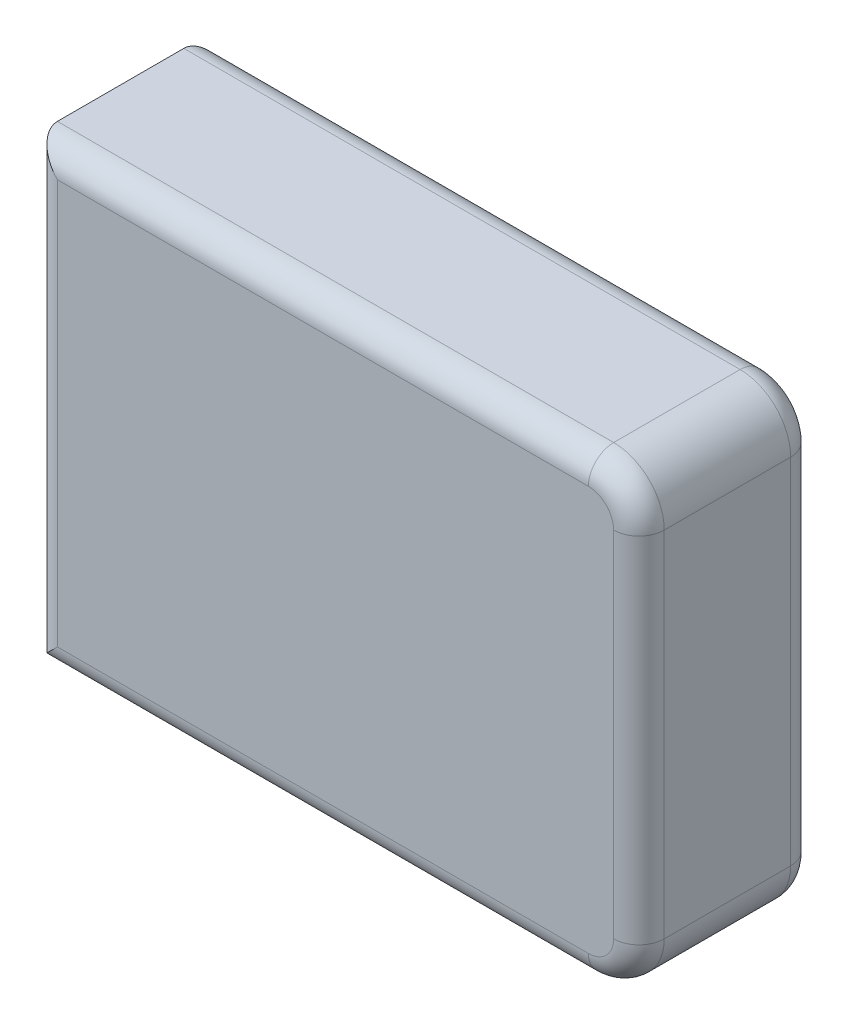
ISO-10303-21;
HEADER;
FILE_DESCRIPTION(('STEP AP214'),'2;1');
FILE_NAME('part.step','',(''),(''),'','','');
FILE_SCHEMA(('AUTOMOTIVE_DESIGN { 1 0 10303 214 1 1 1 1 }'));
ENDSEC;
DATA;
#1=APPLICATION_CONTEXT('core data for automotive mechanical design processes');
#2=APPLICATION_PROTOCOL_DEFINITION('international standard','automotive_design',2000,#1);
#3=PRODUCT_CONTEXT('',#1,'mechanical');
#4=PRODUCT('Part','Part','',(#3));
#5=PRODUCT_RELATED_PRODUCT_CATEGORY('part','',(#4));
#6=PRODUCT_DEFINITION_FORMATION('','',#4);
#7=PRODUCT_DEFINITION_CONTEXT('part definition',#1,'design');
#8=PRODUCT_DEFINITION('design','',#6,#7);
#9=PRODUCT_DEFINITION_SHAPE('','',#8);
#10=(LENGTH_UNIT() NAMED_UNIT(*) SI_UNIT(.MILLI.,.METRE.));
#11=(NAMED_UNIT(*) PLANE_ANGLE_UNIT() SI_UNIT($,.RADIAN.));
#12=(NAMED_UNIT(*) SI_UNIT($,.STERADIAN.) SOLID_ANGLE_UNIT());
#13=UNCERTAINTY_MEASURE_WITH_UNIT(LENGTH_MEASURE(1.E-05),#10,'distance_accuracy_value','');
#14=(GEOMETRIC_REPRESENTATION_CONTEXT(3) GLOBAL_UNCERTAINTY_ASSIGNED_CONTEXT((#13)) GLOBAL_UNIT_ASSIGNED_CONTEXT((#10,
#11,#12)) REPRESENTATION_CONTEXT('',''));
#15=CARTESIAN_POINT('',(0.,0.,0.));
#16=DIRECTION('',(0.,0.,1.));
#17=DIRECTION('',(1.,0.,0.));
#18=AXIS2_PLACEMENT_3D('',#15,#16,#17);
#19=CARTESIAN_POINT('',(60.,45.,35.));
#20=DIRECTION('',(-1.,0.,0.));
#21=DIRECTION('',(0.,-1.,0.));
#22=AXIS2_PLACEMENT_3D('',#19,#20,#21);
#23=PLANE('',#22);
#24=DIRECTION('',(0.,0.,-1.));
#25=VECTOR('',#24,1.);
#26=CARTESIAN_POINT('',(60.,-35.,35.));
#27=LINE('',#26,#25);
#28=CARTESIAN_POINT('',(60.,-35.,30.));
#29=VERTEX_POINT('',#28);
#30=CARTESIAN_POINT('',(60.,-35.,5.));
#31=VERTEX_POINT('',#30);
#32=EDGE_CURVE('E243',#29,#31,#27,.T.);
#33=ORIENTED_EDGE('',*,*,#32,.T.);
#34=DIRECTION('',(0.,1.,0.));
#35=VECTOR('',#34,1.);
#36=CARTESIAN_POINT('',(60.,45.,5.));
#37=LINE('',#36,#35);
#38=CARTESIAN_POINT('',(60.,35.,5.));
#39=VERTEX_POINT('',#38);
#40=EDGE_CURVE('E196',#31,#39,#37,.T.);
#41=ORIENTED_EDGE('',*,*,#40,.T.);
#42=DIRECTION('',(0.,0.,-1.));
#43=VECTOR('',#42,1.);
#44=CARTESIAN_POINT('',(60.,35.,35.));
#45=LINE('',#44,#43);
#46=CARTESIAN_POINT('',(60.,35.,30.));
#47=VERTEX_POINT('',#46);
#48=EDGE_CURVE('E245',#39,#47,#45,.F.);
#49=ORIENTED_EDGE('',*,*,#48,.T.);
#50=DIRECTION('',(0.,1.,0.));
#51=VECTOR('',#50,1.);
#52=CARTESIAN_POINT('',(60.,-35.,30.));
#53=LINE('',#52,#51);
#54=EDGE_CURVE('E201',#47,#29,#53,.F.);
#55=ORIENTED_EDGE('',*,*,#54,.T.);
#56=EDGE_LOOP('',(#33,#41,#49,#55));
#57=FACE_BOUND('',#56,.T.);
#58=ADVANCED_FACE('F38',(#57),#23,.F.);
#59=CARTESIAN_POINT('',(-60.,45.,35.));
#60=DIRECTION('',(0.,-1.,0.));
#61=DIRECTION('',(0.,0.,-1.));
#62=AXIS2_PLACEMENT_3D('',#59,#60,#61);
#63=PLANE('',#62);
#64=DIRECTION('',(0.,0.,-1.));
#65=VECTOR('',#64,1.);
#66=CARTESIAN_POINT('',(50.,45.,35.));
#67=LINE('',#66,#65);
#68=CARTESIAN_POINT('',(50.,45.,30.));
#69=VERTEX_POINT('',#68);
#70=CARTESIAN_POINT('',(50.,45.,5.));
#71=VERTEX_POINT('',#70);
#72=EDGE_CURVE('E152',#69,#71,#67,.T.);
#73=ORIENTED_EDGE('',*,*,#72,.T.);
#74=DIRECTION('',(-1.,0.,0.));
#75=VECTOR('',#74,1.);
#76=CARTESIAN_POINT('',(-60.,45.,5.));
#77=LINE('',#76,#75);
#78=CARTESIAN_POINT('',(-60.,45.,5.));
#79=VERTEX_POINT('',#78);
#80=EDGE_CURVE('E55',#71,#79,#77,.T.);
#81=ORIENTED_EDGE('',*,*,#80,.T.);
#82=DIRECTION('',(0.,0.,-1.));
#83=VECTOR('',#82,1.);
#84=CARTESIAN_POINT('',(-60.,45.,35.));
#85=LINE('',#84,#83);
#86=CARTESIAN_POINT('',(-60.,45.,30.));
#87=VERTEX_POINT('',#86);
#88=EDGE_CURVE('E247',#87,#79,#85,.T.);
#89=ORIENTED_EDGE('',*,*,#88,.F.);
#90=DIRECTION('',(-1.,0.,0.));
#91=VECTOR('',#90,1.);
#92=CARTESIAN_POINT('',(50.,45.,30.));
#93=LINE('',#92,#91);
#94=EDGE_CURVE('E206',#87,#69,#93,.F.);
#95=ORIENTED_EDGE('',*,*,#94,.T.);
#96=EDGE_LOOP('',(#73,#81,#89,#95));
#97=FACE_BOUND('',#96,.T.);
#98=ADVANCED_FACE('F274',(#97),#63,.F.);
#99=CARTESIAN_POINT('',(-60.,45.,35.));
#100=DIRECTION('',(1.,0.,0.));
#101=DIRECTION('',(0.,1.,0.));
#102=AXIS2_PLACEMENT_3D('',#99,#100,#101);
#103=PLANE('',#102);
#104=ORIENTED_EDGE('',*,*,#88,.T.);
#105=DIRECTION('',(0.,-1.,0.));
#106=VECTOR('',#105,1.);
#107=CARTESIAN_POINT('',(-60.,45.,5.));
#108=LINE('',#107,#106);
#109=CARTESIAN_POINT('',(-60.,-45.,5.));
#110=VERTEX_POINT('',#109);
#111=EDGE_CURVE('E208',#79,#110,#108,.T.);
#112=ORIENTED_EDGE('',*,*,#111,.T.);
#113=DIRECTION('',(0.,0.,-1.));
#114=VECTOR('',#113,1.);
#115=CARTESIAN_POINT('',(-60.,-45.,35.));
#116=LINE('',#115,#114);
#117=CARTESIAN_POINT('',(-60.,-45.,30.));
#118=VERTEX_POINT('',#117);
#119=EDGE_CURVE('E158',#118,#110,#116,.T.);
#120=ORIENTED_EDGE('',*,*,#119,.F.);
#121=DIRECTION('',(0.,-1.,0.));
#122=VECTOR('',#121,1.);
#123=CARTESIAN_POINT('',(-60.,45.,30.));
#124=LINE('',#123,#122);
#125=EDGE_CURVE('E62',#118,#87,#124,.F.);
#126=ORIENTED_EDGE('',*,*,#125,.T.);
#127=EDGE_LOOP('',(#104,#112,#120,#126));
#128=FACE_BOUND('',#127,.T.);
#129=ADVANCED_FACE('F279',(#128),#103,.F.);
#130=CARTESIAN_POINT('',(-60.,-45.,35.));
#131=DIRECTION('',(0.,1.,0.));
#132=DIRECTION('',(0.,0.,1.));
#133=AXIS2_PLACEMENT_3D('',#130,#131,#132);
#134=PLANE('',#133);
#135=ORIENTED_EDGE('',*,*,#119,.T.);
#136=DIRECTION('',(1.,0.,0.));
#137=VECTOR('',#136,1.);
#138=CARTESIAN_POINT('',(-60.,-45.,5.));
#139=LINE('',#138,#137);
#140=CARTESIAN_POINT('',(50.,-45.,5.));
#141=VERTEX_POINT('',#140);
#142=EDGE_CURVE('E11',#110,#141,#139,.T.);
#143=ORIENTED_EDGE('',*,*,#142,.T.);
#144=DIRECTION('',(0.,0.,-1.));
#145=VECTOR('',#144,1.);
#146=CARTESIAN_POINT('',(50.,-45.,35.));
#147=LINE('',#146,#145);
#148=CARTESIAN_POINT('',(50.,-45.,30.));
#149=VERTEX_POINT('',#148);
#150=EDGE_CURVE('E240',#141,#149,#147,.F.);
#151=ORIENTED_EDGE('',*,*,#150,.T.);
#152=DIRECTION('',(1.,0.,0.));
#153=VECTOR('',#152,1.);
#154=CARTESIAN_POINT('',(-60.,-45.,30.));
#155=LINE('',#154,#153);
#156=EDGE_CURVE('E47',#149,#118,#155,.F.);
#157=ORIENTED_EDGE('',*,*,#156,.T.);
#158=EDGE_LOOP('',(#135,#143,#151,#157));
#159=FACE_BOUND('',#158,.T.);
#160=ADVANCED_FACE('F251',(#159),#134,.F.);
#161=CARTESIAN_POINT('',(0.,0.,35.));
#162=DIRECTION('',(0.,0.,1.));
#163=DIRECTION('',(1.,0.,0.));
#164=AXIS2_PLACEMENT_3D('',#161,#162,#163);
#165=PLANE('',#164);
#166=CARTESIAN_POINT('',(50.,35.,35.));
#167=DIRECTION('',(0.,0.,1.));
#168=DIRECTION('',(1.,0.,0.));
#169=AXIS2_PLACEMENT_3D('',#166,#167,#168);
#170=CIRCLE('',#169,5.);
#171=CARTESIAN_POINT('',(55.,35.,35.));
#172=VERTEX_POINT('',#171);
#173=CARTESIAN_POINT('',(50.,40.,35.));
#174=VERTEX_POINT('',#173);
#175=EDGE_CURVE('E220',#172,#174,#170,.T.);
#176=ORIENTED_EDGE('',*,*,#175,.T.);
#177=DIRECTION('',(-1.,0.,0.));
#178=VECTOR('',#177,1.);
#179=CARTESIAN_POINT('',(-60.,40.,35.));
#180=LINE('',#179,#178);
#181=CARTESIAN_POINT('',(-55.,40.,35.));
#182=VERTEX_POINT('',#181);
#183=EDGE_CURVE('E211',#174,#182,#180,.T.);
#184=ORIENTED_EDGE('',*,*,#183,.T.);
#185=DIRECTION('',(0.,-1.,0.));
#186=VECTOR('',#185,1.);
#187=CARTESIAN_POINT('',(-55.,-45.,35.));
#188=LINE('',#187,#186);
#189=CARTESIAN_POINT('',(-55.,-40.,35.));
#190=VERTEX_POINT('',#189);
#191=EDGE_CURVE('E213',#182,#190,#188,.T.);
#192=ORIENTED_EDGE('',*,*,#191,.T.);
#193=DIRECTION('',(1.,0.,0.));
#194=VECTOR('',#193,1.);
#195=CARTESIAN_POINT('',(50.,-40.,35.));
#196=LINE('',#195,#194);
#197=CARTESIAN_POINT('',(50.,-40.,35.));
#198=VERTEX_POINT('',#197);
#199=EDGE_CURVE('E215',#190,#198,#196,.T.);
#200=ORIENTED_EDGE('',*,*,#199,.T.);
#201=CARTESIAN_POINT('',(50.,-35.,35.));
#202=DIRECTION('',(0.,0.,1.));
#203=DIRECTION('',(1.,0.,0.));
#204=AXIS2_PLACEMENT_3D('',#201,#202,#203);
#205=CIRCLE('',#204,5.);
#206=CARTESIAN_POINT('',(55.,-35.,35.));
#207=VERTEX_POINT('',#206);
#208=EDGE_CURVE('E217',#198,#207,#205,.T.);
#209=ORIENTED_EDGE('',*,*,#208,.T.);
#210=DIRECTION('',(0.,1.,0.));
#211=VECTOR('',#210,1.);
#212=CARTESIAN_POINT('',(55.,35.,35.));
#213=LINE('',#212,#211);
#214=EDGE_CURVE('E222',#207,#172,#213,.T.);
#215=ORIENTED_EDGE('',*,*,#214,.T.);
#216=EDGE_LOOP('',(#176,#184,#192,#200,#209,#215));
#217=FACE_BOUND('',#216,.T.);
#218=ADVANCED_FACE('F312',(#217),#165,.T.);
#219=CARTESIAN_POINT('',(0.,0.,0.));
#220=DIRECTION('',(0.,0.,1.));
#221=DIRECTION('',(1.,0.,0.));
#222=AXIS2_PLACEMENT_3D('',#219,#220,#221);
#223=PLANE('',#222);
#224=DIRECTION('',(-1.,0.,0.));
#225=VECTOR('',#224,1.);
#226=CARTESIAN_POINT('',(0.,40.,0.));
#227=LINE('',#226,#225);
#228=CARTESIAN_POINT('',(-55.,40.,0.));
#229=VERTEX_POINT('',#228);
#230=CARTESIAN_POINT('',(50.,40.,0.));
#231=VERTEX_POINT('',#230);
#232=EDGE_CURVE('E235',#229,#231,#227,.F.);
#233=ORIENTED_EDGE('',*,*,#232,.T.);
#234=CARTESIAN_POINT('',(50.,35.,0.));
#235=DIRECTION('',(0.,0.,1.));
#236=DIRECTION('',(1.,0.,0.));
#237=AXIS2_PLACEMENT_3D('',#234,#235,#236);
#238=CIRCLE('',#237,5.);
#239=CARTESIAN_POINT('',(55.,35.,0.));
#240=VERTEX_POINT('',#239);
#241=EDGE_CURVE('E233',#231,#240,#238,.F.);
#242=ORIENTED_EDGE('',*,*,#241,.T.);
#243=DIRECTION('',(0.,1.,0.));
#244=VECTOR('',#243,1.);
#245=CARTESIAN_POINT('',(55.,0.,0.));
#246=LINE('',#245,#244);
#247=CARTESIAN_POINT('',(55.,-35.,0.));
#248=VERTEX_POINT('',#247);
#249=EDGE_CURVE('E136',#240,#248,#246,.F.);
#250=ORIENTED_EDGE('',*,*,#249,.T.);
#251=CARTESIAN_POINT('',(50.,-35.,0.));
#252=DIRECTION('',(0.,0.,1.));
#253=DIRECTION('',(1.,0.,0.));
#254=AXIS2_PLACEMENT_3D('',#251,#252,#253);
#255=CIRCLE('',#254,5.);
#256=CARTESIAN_POINT('',(50.,-40.,0.));
#257=VERTEX_POINT('',#256);
#258=EDGE_CURVE('E129',#248,#257,#255,.F.);
#259=ORIENTED_EDGE('',*,*,#258,.T.);
#260=DIRECTION('',(1.,0.,0.));
#261=VECTOR('',#260,1.);
#262=CARTESIAN_POINT('',(0.,-40.,0.));
#263=LINE('',#262,#261);
#264=CARTESIAN_POINT('',(-55.,-40.,0.));
#265=VERTEX_POINT('',#264);
#266=EDGE_CURVE('E132',#257,#265,#263,.F.);
#267=ORIENTED_EDGE('',*,*,#266,.T.);
#268=DIRECTION('',(0.,-1.,0.));
#269=VECTOR('',#268,1.);
#270=CARTESIAN_POINT('',(-55.,0.,0.));
#271=LINE('',#270,#269);
#272=EDGE_CURVE('E141',#265,#229,#271,.F.);
#273=ORIENTED_EDGE('',*,*,#272,.T.);
#274=EDGE_LOOP('',(#233,#242,#250,#259,#267,#273));
#275=FACE_BOUND('',#274,.T.);
#276=ADVANCED_FACE('F131',(#275),#223,.F.);
#277=CARTESIAN_POINT('',(50.,-35.,35.));
#278=DIRECTION('',(0.,0.,-1.));
#279=DIRECTION('',(-1.,0.,0.));
#280=AXIS2_PLACEMENT_3D('',#277,#278,#279);
#281=CYLINDRICAL_SURFACE('',#280,10.);
#282=ORIENTED_EDGE('',*,*,#150,.F.);
#283=CARTESIAN_POINT('',(50.,-35.,5.));
#284=DIRECTION('',(0.,0.,1.));
#285=DIRECTION('',(1.,0.,0.));
#286=AXIS2_PLACEMENT_3D('',#283,#284,#285);
#287=CIRCLE('',#286,10.);
#288=EDGE_CURVE('E155',#141,#31,#287,.T.);
#289=ORIENTED_EDGE('',*,*,#288,.T.);
#290=ORIENTED_EDGE('',*,*,#32,.F.);
#291=CARTESIAN_POINT('',(50.,-35.,30.));
#292=DIRECTION('',(0.,0.,1.));
#293=DIRECTION('',(1.,0.,0.));
#294=AXIS2_PLACEMENT_3D('',#291,#292,#293);
#295=CIRCLE('',#294,10.);
#296=EDGE_CURVE('E225',#29,#149,#295,.F.);
#297=ORIENTED_EDGE('',*,*,#296,.T.);
#298=EDGE_LOOP('',(#282,#289,#290,#297));
#299=FACE_BOUND('',#298,.T.);
#300=ADVANCED_FACE('F283',(#299),#281,.T.);
#301=CARTESIAN_POINT('',(50.,35.,35.));
#302=DIRECTION('',(0.,0.,-1.));
#303=DIRECTION('',(-1.,0.,0.));
#304=AXIS2_PLACEMENT_3D('',#301,#302,#303);
#305=CYLINDRICAL_SURFACE('',#304,10.);
#306=ORIENTED_EDGE('',*,*,#48,.F.);
#307=CARTESIAN_POINT('',(50.,35.,5.));
#308=DIRECTION('',(0.,0.,1.));
#309=DIRECTION('',(1.,0.,0.));
#310=AXIS2_PLACEMENT_3D('',#307,#308,#309);
#311=CIRCLE('',#310,10.);
#312=EDGE_CURVE('E228',#39,#71,#311,.T.);
#313=ORIENTED_EDGE('',*,*,#312,.T.);
#314=ORIENTED_EDGE('',*,*,#72,.F.);
#315=CARTESIAN_POINT('',(50.,35.,30.));
#316=DIRECTION('',(0.,0.,1.));
#317=DIRECTION('',(1.,0.,0.));
#318=AXIS2_PLACEMENT_3D('',#315,#316,#317);
#319=CIRCLE('',#318,10.);
#320=EDGE_CURVE('E231',#69,#47,#319,.F.);
#321=ORIENTED_EDGE('',*,*,#320,.T.);
#322=EDGE_LOOP('',(#306,#313,#314,#321));
#323=FACE_BOUND('',#322,.T.);
#324=ADVANCED_FACE('F285',(#323),#305,.T.);
#325=CARTESIAN_POINT('',(-60.,-40.,5.));
#326=DIRECTION('',(1.,0.,0.));
#327=DIRECTION('',(0.,0.,-1.));
#328=AXIS2_PLACEMENT_3D('',#325,#326,#327);
#329=CYLINDRICAL_SURFACE('',#328,5.);
#330=CARTESIAN_POINT('',(50.,-40.,5.));
#331=DIRECTION('',(1.,0.,0.));
#332=DIRECTION('',(0.,0.,-1.));
#333=AXIS2_PLACEMENT_3D('',#330,#331,#332);
#334=CIRCLE('',#333,5.);
#335=EDGE_CURVE('E147',#141,#257,#334,.T.);
#336=ORIENTED_EDGE('',*,*,#335,.F.);
#337=ORIENTED_EDGE('',*,*,#142,.F.);
#338=CARTESIAN_POINT('',(-55.,-40.,5.));
#339=DIRECTION('',(0.707106781186548,-0.707106781186547,0.));
#340=DIRECTION('',(0.707106781186547,0.707106781186548,0.));
#341=AXIS2_PLACEMENT_3D('',#338,#339,#340);
#342=ELLIPSE('',#341,7.07106781186547,5.);
#343=EDGE_CURVE('E150',#265,#110,#342,.F.);
#344=ORIENTED_EDGE('',*,*,#343,.F.);
#345=ORIENTED_EDGE('',*,*,#266,.F.);
#346=EDGE_LOOP('',(#336,#337,#344,#345));
#347=FACE_BOUND('',#346,.T.);
#348=ADVANCED_FACE('F145',(#347),#329,.T.);
#349=CARTESIAN_POINT('',(-55.,45.,5.));
#350=DIRECTION('',(0.,-1.,0.));
#351=DIRECTION('',(1.,0.,0.));
#352=AXIS2_PLACEMENT_3D('',#349,#350,#351);
#353=CYLINDRICAL_SURFACE('',#352,5.);
#354=ORIENTED_EDGE('',*,*,#343,.T.);
#355=ORIENTED_EDGE('',*,*,#111,.F.);
#356=CARTESIAN_POINT('',(-55.,40.,5.));
#357=DIRECTION('',(-0.707106781186547,-0.707106781186548,0.));
#358=DIRECTION('',(-0.707106781186548,0.707106781186547,0.));
#359=AXIS2_PLACEMENT_3D('',#356,#357,#358);
#360=ELLIPSE('',#359,7.07106781186548,5.);
#361=EDGE_CURVE('E156',#229,#79,#360,.F.);
#362=ORIENTED_EDGE('',*,*,#361,.F.);
#363=ORIENTED_EDGE('',*,*,#272,.F.);
#364=EDGE_LOOP('',(#354,#355,#362,#363));
#365=FACE_BOUND('',#364,.T.);
#366=ADVANCED_FACE('F256',(#365),#353,.T.);
#367=CARTESIAN_POINT('',(50.,-35.,5.));
#368=DIRECTION('',(0.,0.,1.));
#369=DIRECTION('',(1.,0.,0.));
#370=AXIS2_PLACEMENT_3D('',#367,#368,#369);
#371=DEGENERATE_TOROIDAL_SURFACE('',#370,5.,5.,.T.);
#372=ORIENTED_EDGE('',*,*,#335,.T.);
#373=ORIENTED_EDGE('',*,*,#258,.F.);
#374=CARTESIAN_POINT('',(55.,-35.,5.));
#375=DIRECTION('',(0.,1.,0.));
#376=DIRECTION('',(0.,0.,1.));
#377=AXIS2_PLACEMENT_3D('',#374,#375,#376);
#378=CIRCLE('',#377,5.);
#379=EDGE_CURVE('E161',#31,#248,#378,.T.);
#380=ORIENTED_EDGE('',*,*,#379,.F.);
#381=ORIENTED_EDGE('',*,*,#288,.F.);
#382=EDGE_LOOP('',(#372,#373,#380,#381));
#383=FACE_BOUND('',#382,.T.);
#384=ADVANCED_FACE('F154',(#383),#371,.T.);
#385=CARTESIAN_POINT('',(-60.,40.,5.));
#386=DIRECTION('',(-1.,0.,0.));
#387=DIRECTION('',(0.,0.,1.));
#388=AXIS2_PLACEMENT_3D('',#385,#386,#387);
#389=CYLINDRICAL_SURFACE('',#388,5.);
#390=ORIENTED_EDGE('',*,*,#361,.T.);
#391=ORIENTED_EDGE('',*,*,#80,.F.);
#392=CARTESIAN_POINT('',(50.,40.,5.));
#393=DIRECTION('',(1.,0.,0.));
#394=DIRECTION('',(0.,0.,-1.));
#395=AXIS2_PLACEMENT_3D('',#392,#393,#394);
#396=CIRCLE('',#395,5.);
#397=EDGE_CURVE('E185',#231,#71,#396,.T.);
#398=ORIENTED_EDGE('',*,*,#397,.F.);
#399=ORIENTED_EDGE('',*,*,#232,.F.);
#400=EDGE_LOOP('',(#390,#391,#398,#399));
#401=FACE_BOUND('',#400,.T.);
#402=ADVANCED_FACE('F261',(#401),#389,.T.);
#403=CARTESIAN_POINT('',(55.,45.,5.));
#404=DIRECTION('',(0.,1.,0.));
#405=DIRECTION('',(-1.,0.,0.));
#406=AXIS2_PLACEMENT_3D('',#403,#404,#405);
#407=CYLINDRICAL_SURFACE('',#406,5.);
#408=ORIENTED_EDGE('',*,*,#379,.T.);
#409=ORIENTED_EDGE('',*,*,#249,.F.);
#410=CARTESIAN_POINT('',(55.,35.,5.));
#411=DIRECTION('',(0.,1.,0.));
#412=DIRECTION('',(0.,0.,1.));
#413=AXIS2_PLACEMENT_3D('',#410,#411,#412);
#414=CIRCLE('',#413,5.);
#415=EDGE_CURVE('E181',#39,#240,#414,.T.);
#416=ORIENTED_EDGE('',*,*,#415,.F.);
#417=ORIENTED_EDGE('',*,*,#40,.F.);
#418=EDGE_LOOP('',(#408,#409,#416,#417));
#419=FACE_BOUND('',#418,.T.);
#420=ADVANCED_FACE('F195',(#419),#407,.T.);
#421=CARTESIAN_POINT('',(50.,35.,5.));
#422=DIRECTION('',(0.,0.,1.));
#423=DIRECTION('',(1.,0.,0.));
#424=AXIS2_PLACEMENT_3D('',#421,#422,#423);
#425=DEGENERATE_TOROIDAL_SURFACE('',#424,5.,5.,.T.);
#426=ORIENTED_EDGE('',*,*,#397,.T.);
#427=ORIENTED_EDGE('',*,*,#312,.F.);
#428=ORIENTED_EDGE('',*,*,#415,.T.);
#429=ORIENTED_EDGE('',*,*,#241,.F.);
#430=EDGE_LOOP('',(#426,#427,#428,#429));
#431=FACE_BOUND('',#430,.T.);
#432=ADVANCED_FACE('F262',(#431),#425,.T.);
#433=CARTESIAN_POINT('',(0.,40.,30.));
#434=DIRECTION('',(1.,0.,0.));
#435=DIRECTION('',(0.,0.,-1.));
#436=AXIS2_PLACEMENT_3D('',#433,#434,#435);
#437=CYLINDRICAL_SURFACE('',#436,5.);
#438=CARTESIAN_POINT('',(50.,40.,30.));
#439=DIRECTION('',(1.,0.,0.));
#440=DIRECTION('',(0.,0.,-1.));
#441=AXIS2_PLACEMENT_3D('',#438,#439,#440);
#442=CIRCLE('',#441,5.);
#443=EDGE_CURVE('E174',#69,#174,#442,.T.);
#444=ORIENTED_EDGE('',*,*,#443,.F.);
#445=ORIENTED_EDGE('',*,*,#94,.F.);
#446=CARTESIAN_POINT('',(-55.,40.,30.));
#447=DIRECTION('',(0.707106781186547,0.707106781186548,0.));
#448=DIRECTION('',(-0.707106781186548,0.707106781186547,0.));
#449=AXIS2_PLACEMENT_3D('',#446,#447,#448);
#450=ELLIPSE('',#449,7.07106781186548,5.);
#451=EDGE_CURVE('E42',#182,#87,#450,.F.);
#452=ORIENTED_EDGE('',*,*,#451,.F.);
#453=ORIENTED_EDGE('',*,*,#183,.F.);
#454=EDGE_LOOP('',(#444,#445,#452,#453));
#455=FACE_BOUND('',#454,.T.);
#456=ADVANCED_FACE('F40',(#455),#437,.T.);
#457=CARTESIAN_POINT('',(-55.,0.,30.));
#458=DIRECTION('',(0.,1.,0.));
#459=DIRECTION('',(-1.,0.,0.));
#460=AXIS2_PLACEMENT_3D('',#457,#458,#459);
#461=CYLINDRICAL_SURFACE('',#460,5.);
#462=ORIENTED_EDGE('',*,*,#451,.T.);
#463=ORIENTED_EDGE('',*,*,#125,.F.);
#464=CARTESIAN_POINT('',(-55.,-40.,30.));
#465=DIRECTION('',(-0.707106781186548,0.707106781186547,0.));
#466=DIRECTION('',(-0.707106781186547,-0.707106781186548,0.));
#467=AXIS2_PLACEMENT_3D('',#464,#465,#466);
#468=ELLIPSE('',#467,7.07106781186547,5.);
#469=EDGE_CURVE('E172',#190,#118,#468,.F.);
#470=ORIENTED_EDGE('',*,*,#469,.F.);
#471=ORIENTED_EDGE('',*,*,#191,.F.);
#472=EDGE_LOOP('',(#462,#463,#470,#471));
#473=FACE_BOUND('',#472,.T.);
#474=ADVANCED_FACE('F269',(#473),#461,.T.);
#475=CARTESIAN_POINT('',(50.,35.,30.));
#476=DIRECTION('',(0.,0.,1.));
#477=DIRECTION('',(1.,0.,0.));
#478=AXIS2_PLACEMENT_3D('',#475,#476,#477);
#479=DEGENERATE_TOROIDAL_SURFACE('',#478,5.,5.,.T.);
#480=ORIENTED_EDGE('',*,*,#443,.T.);
#481=ORIENTED_EDGE('',*,*,#175,.F.);
#482=CARTESIAN_POINT('',(55.,35.,30.));
#483=DIRECTION('',(0.,-1.,0.));
#484=DIRECTION('',(0.,0.,-1.));
#485=AXIS2_PLACEMENT_3D('',#482,#483,#484);
#486=CIRCLE('',#485,5.);
#487=EDGE_CURVE('E169',#47,#172,#486,.T.);
#488=ORIENTED_EDGE('',*,*,#487,.F.);
#489=ORIENTED_EDGE('',*,*,#320,.F.);
#490=EDGE_LOOP('',(#480,#481,#488,#489));
#491=FACE_BOUND('',#490,.T.);
#492=ADVANCED_FACE('F297',(#491),#479,.T.);
#493=CARTESIAN_POINT('',(0.,-40.,30.));
#494=DIRECTION('',(-1.,0.,0.));
#495=DIRECTION('',(0.,0.,1.));
#496=AXIS2_PLACEMENT_3D('',#493,#494,#495);
#497=CYLINDRICAL_SURFACE('',#496,5.);
#498=ORIENTED_EDGE('',*,*,#469,.T.);
#499=ORIENTED_EDGE('',*,*,#156,.F.);
#500=CARTESIAN_POINT('',(50.,-40.,30.));
#501=DIRECTION('',(1.,0.,0.));
#502=DIRECTION('',(0.,0.,-1.));
#503=AXIS2_PLACEMENT_3D('',#500,#501,#502);
#504=CIRCLE('',#503,5.);
#505=EDGE_CURVE('E167',#198,#149,#504,.T.);
#506=ORIENTED_EDGE('',*,*,#505,.F.);
#507=ORIENTED_EDGE('',*,*,#199,.F.);
#508=EDGE_LOOP('',(#498,#499,#506,#507));
#509=FACE_BOUND('',#508,.T.);
#510=ADVANCED_FACE('F309',(#509),#497,.T.);
#511=CARTESIAN_POINT('',(55.,0.,30.));
#512=DIRECTION('',(0.,-1.,0.));
#513=DIRECTION('',(1.,0.,0.));
#514=AXIS2_PLACEMENT_3D('',#511,#512,#513);
#515=CYLINDRICAL_SURFACE('',#514,5.);
#516=ORIENTED_EDGE('',*,*,#487,.T.);
#517=ORIENTED_EDGE('',*,*,#214,.F.);
#518=CARTESIAN_POINT('',(55.,-35.,30.));
#519=DIRECTION('',(0.,-1.,0.));
#520=DIRECTION('',(0.,0.,-1.));
#521=AXIS2_PLACEMENT_3D('',#518,#519,#520);
#522=CIRCLE('',#521,5.);
#523=EDGE_CURVE('E165',#29,#207,#522,.T.);
#524=ORIENTED_EDGE('',*,*,#523,.F.);
#525=ORIENTED_EDGE('',*,*,#54,.F.);
#526=EDGE_LOOP('',(#516,#517,#524,#525));
#527=FACE_BOUND('',#526,.T.);
#528=ADVANCED_FACE('F301',(#527),#515,.T.);
#529=CARTESIAN_POINT('',(50.,-35.,30.));
#530=DIRECTION('',(0.,0.,1.));
#531=DIRECTION('',(1.,0.,0.));
#532=AXIS2_PLACEMENT_3D('',#529,#530,#531);
#533=DEGENERATE_TOROIDAL_SURFACE('',#532,5.,5.,.T.);
#534=ORIENTED_EDGE('',*,*,#505,.T.);
#535=ORIENTED_EDGE('',*,*,#296,.F.);
#536=ORIENTED_EDGE('',*,*,#523,.T.);
#537=ORIENTED_EDGE('',*,*,#208,.F.);
#538=EDGE_LOOP('',(#534,#535,#536,#537));
#539=FACE_BOUND('',#538,.T.);
#540=ADVANCED_FACE('F305',(#539),#533,.T.);
#541=CLOSED_SHELL('',(#58,#98,#129,#160,#218,#276,#300,#324,#348,#366,#384,#402,#420,#432,#456,
#474,#492,#510,#528,#540));
#542=MANIFOLD_SOLID_BREP('B2',#541);
#543=ADVANCED_BREP_SHAPE_REPRESENTATION('',(#18,#542),#14);
#544=SHAPE_DEFINITION_REPRESENTATION(#9,#543);
ENDSEC;
END-ISO-10303-21;
